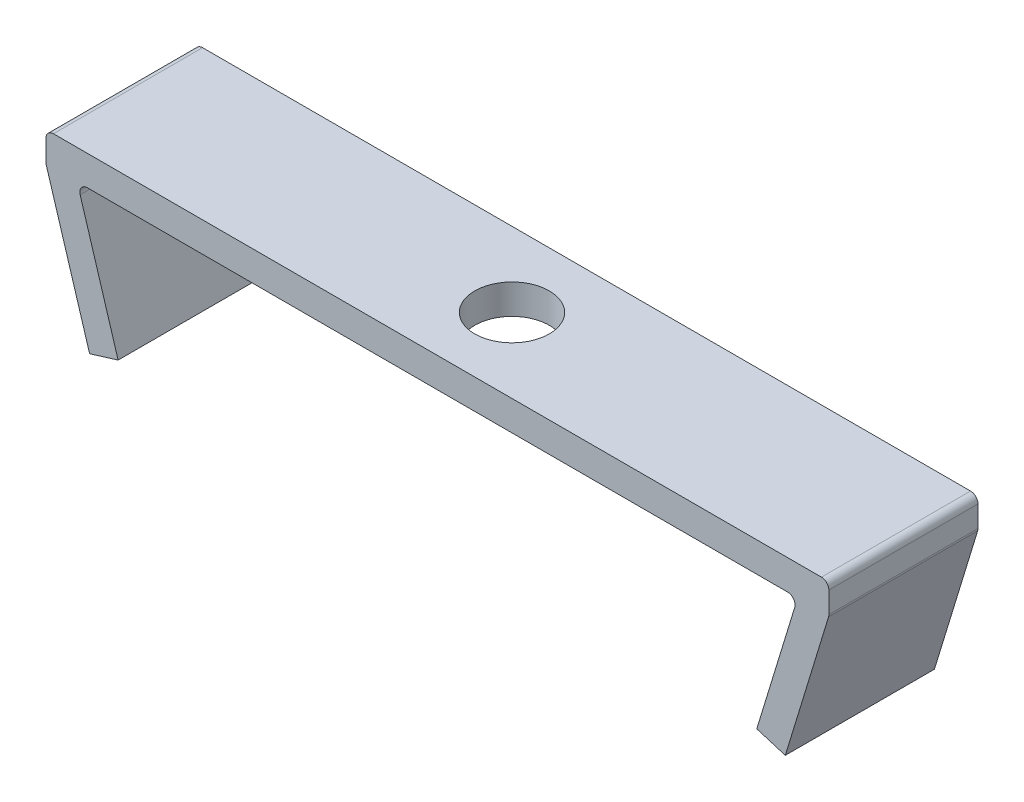
ISO-10303-21;
HEADER;
FILE_DESCRIPTION(('STEP AP214'),'2;1');
FILE_NAME('part.step','',(''),(''),'','','');
FILE_SCHEMA(('AUTOMOTIVE_DESIGN { 1 0 10303 214 1 1 1 1 }'));
ENDSEC;
DATA;
#1=APPLICATION_CONTEXT('core data for automotive mechanical design processes');
#2=APPLICATION_PROTOCOL_DEFINITION('international standard','automotive_design',2000,#1);
#3=PRODUCT_CONTEXT('',#1,'mechanical');
#4=PRODUCT('Part','Part','',(#3));
#5=PRODUCT_RELATED_PRODUCT_CATEGORY('part','',(#4));
#6=PRODUCT_DEFINITION_FORMATION('','',#4);
#7=PRODUCT_DEFINITION_CONTEXT('part definition',#1,'design');
#8=PRODUCT_DEFINITION('design','',#6,#7);
#9=PRODUCT_DEFINITION_SHAPE('','',#8);
#10=(LENGTH_UNIT() NAMED_UNIT(*) SI_UNIT(.MILLI.,.METRE.));
#11=(NAMED_UNIT(*) PLANE_ANGLE_UNIT() SI_UNIT($,.RADIAN.));
#12=(NAMED_UNIT(*) SI_UNIT($,.STERADIAN.) SOLID_ANGLE_UNIT());
#13=UNCERTAINTY_MEASURE_WITH_UNIT(LENGTH_MEASURE(1.E-05),#10,'distance_accuracy_value','');
#14=(GEOMETRIC_REPRESENTATION_CONTEXT(3) GLOBAL_UNCERTAINTY_ASSIGNED_CONTEXT((#13)) GLOBAL_UNIT_ASSIGNED_CONTEXT((#10,
#11,#12)) REPRESENTATION_CONTEXT('',''));
#15=CARTESIAN_POINT('',(0.,0.,0.));
#16=DIRECTION('',(0.,0.,1.));
#17=DIRECTION('',(1.,0.,0.));
#18=AXIS2_PLACEMENT_3D('',#15,#16,#17);
#19=CARTESIAN_POINT('',(66.675,2.54000000000001,12.7));
#20=DIRECTION('',(-1.,0.,0.));
#21=DIRECTION('',(0.,0.,1.));
#22=AXIS2_PLACEMENT_3D('',#19,#20,#21);
#23=PLANE('',#22);
#24=DIRECTION('',(0.,1.,0.));
#25=VECTOR('',#24,1.);
#26=CARTESIAN_POINT('',(66.675,2.54000000000001,12.7));
#27=LINE('',#26,#25);
#28=CARTESIAN_POINT('',(66.675,-2.35019722828658,12.7));
#29=VERTEX_POINT('',#28);
#30=CARTESIAN_POINT('',(66.675,1.26999999999999,12.7));
#31=VERTEX_POINT('',#30);
#32=EDGE_CURVE('E229',#29,#31,#27,.T.);
#33=ORIENTED_EDGE('',*,*,#32,.F.);
#34=DIRECTION('',(0.,0.,-1.));
#35=VECTOR('',#34,1.);
#36=CARTESIAN_POINT('',(66.675,-2.35019722828658,12.7));
#37=LINE('',#36,#35);
#38=CARTESIAN_POINT('',(66.675,-2.35019722828658,-12.7));
#39=VERTEX_POINT('',#38);
#40=EDGE_CURVE('E274',#29,#39,#37,.T.);
#41=ORIENTED_EDGE('',*,*,#40,.T.);
#42=DIRECTION('',(0.,1.,0.));
#43=VECTOR('',#42,1.);
#44=CARTESIAN_POINT('',(66.675,2.54000000000001,-12.7));
#45=LINE('',#44,#43);
#46=CARTESIAN_POINT('',(66.675,1.26999999999999,-12.7));
#47=VERTEX_POINT('',#46);
#48=EDGE_CURVE('E204',#39,#47,#45,.T.);
#49=ORIENTED_EDGE('',*,*,#48,.T.);
#50=DIRECTION('',(0.,0.,-1.));
#51=VECTOR('',#50,1.);
#52=CARTESIAN_POINT('',(66.675,1.26999999999999,12.7));
#53=LINE('',#52,#51);
#54=EDGE_CURVE('E272',#47,#31,#53,.F.);
#55=ORIENTED_EDGE('',*,*,#54,.T.);
#56=EDGE_LOOP('',(#33,#41,#49,#55));
#57=FACE_BOUND('',#56,.T.);
#58=ADVANCED_FACE('F50',(#57),#23,.F.);
#59=CARTESIAN_POINT('',(-66.675,2.54000000000001,12.7));
#60=DIRECTION('',(0.,-1.,0.));
#61=DIRECTION('',(1.,0.,0.));
#62=AXIS2_PLACEMENT_3D('',#59,#60,#61);
#63=PLANE('',#62);
#64=CARTESIAN_POINT('',(0.,2.54000000000001,0.));
#65=DIRECTION('',(0.,1.,0.));
#66=DIRECTION('',(0.,0.,1.));
#67=AXIS2_PLACEMENT_3D('',#64,#65,#66);
#68=CIRCLE('',#67,6.35);
#69=CARTESIAN_POINT('',(0.,2.54000000000001,6.35));
#70=VERTEX_POINT('',#69);
#71=EDGE_CURVE('E238',#70,#70,#68,.T.);
#72=ORIENTED_EDGE('',*,*,#71,.F.);
#73=EDGE_LOOP('',(#72));
#74=FACE_BOUND('',#73,.T.);
#75=DIRECTION('',(-1.,0.,0.));
#76=VECTOR('',#75,1.);
#77=CARTESIAN_POINT('',(-66.675,2.54000000000001,-12.7));
#78=LINE('',#77,#76);
#79=CARTESIAN_POINT('',(65.405,2.54000000000001,-12.7));
#80=VERTEX_POINT('',#79);
#81=CARTESIAN_POINT('',(-65.405,2.54000000000001,-12.7));
#82=VERTEX_POINT('',#81);
#83=EDGE_CURVE('E207',#80,#82,#78,.T.);
#84=ORIENTED_EDGE('',*,*,#83,.T.);
#85=DIRECTION('',(0.,0.,-1.));
#86=VECTOR('',#85,1.);
#87=CARTESIAN_POINT('',(-65.405,2.54000000000001,12.7));
#88=LINE('',#87,#86);
#89=CARTESIAN_POINT('',(-65.405,2.54000000000001,12.7));
#90=VERTEX_POINT('',#89);
#91=EDGE_CURVE('E270',#82,#90,#88,.F.);
#92=ORIENTED_EDGE('',*,*,#91,.T.);
#93=DIRECTION('',(-1.,0.,0.));
#94=VECTOR('',#93,1.);
#95=CARTESIAN_POINT('',(-66.675,2.54000000000001,12.7));
#96=LINE('',#95,#94);
#97=CARTESIAN_POINT('',(65.405,2.54000000000001,12.7));
#98=VERTEX_POINT('',#97);
#99=EDGE_CURVE('E356',#98,#90,#96,.T.);
#100=ORIENTED_EDGE('',*,*,#99,.F.);
#101=DIRECTION('',(0.,0.,-1.));
#102=VECTOR('',#101,1.);
#103=CARTESIAN_POINT('',(65.405,2.54000000000001,12.7));
#104=LINE('',#103,#102);
#105=EDGE_CURVE('E267',#98,#80,#104,.T.);
#106=ORIENTED_EDGE('',*,*,#105,.T.);
#107=EDGE_LOOP('',(#84,#92,#100,#106));
#108=FACE_BOUND('',#107,.T.);
#109=ADVANCED_FACE('F316',(#74,#108),#63,.F.);
#110=CARTESIAN_POINT('',(-66.675,2.54000000000001,12.7));
#111=DIRECTION('',(1.,0.,0.));
#112=DIRECTION('',(0.,0.,-1.));
#113=AXIS2_PLACEMENT_3D('',#110,#111,#112);
#114=PLANE('',#113);
#115=DIRECTION('',(0.,-1.,0.));
#116=VECTOR('',#115,1.);
#117=CARTESIAN_POINT('',(-66.675,2.54000000000001,-12.7));
#118=LINE('',#117,#116);
#119=CARTESIAN_POINT('',(-66.675,1.26999999999999,-12.7));
#120=VERTEX_POINT('',#119);
#121=CARTESIAN_POINT('',(-66.675,-2.35019722828658,-12.7));
#122=VERTEX_POINT('',#121);
#123=EDGE_CURVE('E211',#120,#122,#118,.T.);
#124=ORIENTED_EDGE('',*,*,#123,.T.);
#125=DIRECTION('',(0.,0.,-1.));
#126=VECTOR('',#125,1.);
#127=CARTESIAN_POINT('',(-66.675,-2.35019722828658,12.7));
#128=LINE('',#127,#126);
#129=CARTESIAN_POINT('',(-66.675,-2.35019722828658,12.7));
#130=VERTEX_POINT('',#129);
#131=EDGE_CURVE('E258',#122,#130,#128,.F.);
#132=ORIENTED_EDGE('',*,*,#131,.T.);
#133=DIRECTION('',(0.,-1.,0.));
#134=VECTOR('',#133,1.);
#135=CARTESIAN_POINT('',(-66.675,2.54000000000001,12.7));
#136=LINE('',#135,#134);
#137=CARTESIAN_POINT('',(-66.675,1.26999999999999,12.7));
#138=VERTEX_POINT('',#137);
#139=EDGE_CURVE('E175',#138,#130,#136,.T.);
#140=ORIENTED_EDGE('',*,*,#139,.F.);
#141=DIRECTION('',(0.,0.,-1.));
#142=VECTOR('',#141,1.);
#143=CARTESIAN_POINT('',(-66.675,1.26999999999999,12.7));
#144=LINE('',#143,#142);
#145=EDGE_CURVE('E255',#138,#120,#144,.T.);
#146=ORIENTED_EDGE('',*,*,#145,.T.);
#147=EDGE_LOOP('',(#124,#132,#140,#146));
#148=FACE_BOUND('',#147,.T.);
#149=ADVANCED_FACE('F322',(#148),#114,.F.);
#150=CARTESIAN_POINT('',(-66.675,-2.53999999999999,12.7));
#151=DIRECTION('',(0.956304755963036,0.292371704722734,0.));
#152=DIRECTION('',(-0.292371704722734,0.956304755963036,0.));
#153=AXIS2_PLACEMENT_3D('',#150,#151,#152);
#154=PLANE('',#153);
#155=DIRECTION('',(0.292371704722734,-0.956304755963036,0.));
#156=VECTOR('',#155,1.);
#157=CARTESIAN_POINT('',(-66.675,-2.53999999999999,12.7));
#158=LINE('',#157,#156);
#159=CARTESIAN_POINT('',(-66.6195070400731,-2.72150929328444,12.7));
#160=VERTEX_POINT('',#159);
#161=CARTESIAN_POINT('',(-59.2487587000426,-26.8301408014611,12.7));
#162=VERTEX_POINT('',#161);
#163=EDGE_CURVE('E162',#160,#162,#158,.T.);
#164=ORIENTED_EDGE('',*,*,#163,.F.);
#165=DIRECTION('',(0.,0.,-1.));
#166=VECTOR('',#165,1.);
#167=CARTESIAN_POINT('',(-66.6195070400731,-2.72150929328444,12.7));
#168=LINE('',#167,#166);
#169=CARTESIAN_POINT('',(-66.6195070400731,-2.72150929328444,-12.7));
#170=VERTEX_POINT('',#169);
#171=EDGE_CURVE('E245',#160,#170,#168,.T.);
#172=ORIENTED_EDGE('',*,*,#171,.T.);
#173=DIRECTION('',(0.292371704722734,-0.956304755963036,0.));
#174=VECTOR('',#173,1.);
#175=CARTESIAN_POINT('',(-66.675,-2.53999999999999,-12.7));
#176=LINE('',#175,#174);
#177=CARTESIAN_POINT('',(-59.2487587000426,-26.8301408014611,-12.7));
#178=VERTEX_POINT('',#177);
#179=EDGE_CURVE('E181',#170,#178,#176,.T.);
#180=ORIENTED_EDGE('',*,*,#179,.T.);
#181=DIRECTION('',(0.,0.,-1.));
#182=VECTOR('',#181,1.);
#183=CARTESIAN_POINT('',(-59.2487587000426,-26.8301408014611,12.7));
#184=LINE('',#183,#182);
#185=EDGE_CURVE('E178',#162,#178,#184,.T.);
#186=ORIENTED_EDGE('',*,*,#185,.F.);
#187=EDGE_LOOP('',(#164,#172,#180,#186));
#188=FACE_BOUND('',#187,.T.);
#189=ADVANCED_FACE('F179',(#188),#154,.F.);
#190=CARTESIAN_POINT('',(-59.2487587000426,-26.8301408014611,12.7));
#191=DIRECTION('',(-0.292371704722734,0.956304755963036,0.));
#192=DIRECTION('',(-0.956304755963036,-0.292371704722734,0.));
#193=AXIS2_PLACEMENT_3D('',#190,#191,#192);
#194=PLANE('',#193);
#195=DIRECTION('',(0.956304755963036,0.292371704722734,0.));
#196=VECTOR('',#195,1.);
#197=CARTESIAN_POINT('',(-59.2487587000426,-26.8301408014611,-12.7));
#198=LINE('',#197,#196);
#199=CARTESIAN_POINT('',(-54.3907305397503,-25.3448925414696,-12.7));
#200=VERTEX_POINT('',#199);
#201=EDGE_CURVE('E215',#178,#200,#198,.T.);
#202=ORIENTED_EDGE('',*,*,#201,.T.);
#203=DIRECTION('',(0.,0.,-1.));
#204=VECTOR('',#203,1.);
#205=CARTESIAN_POINT('',(-54.3907305397503,-25.3448925414696,12.7));
#206=LINE('',#205,#204);
#207=CARTESIAN_POINT('',(-54.3907305397503,-25.3448925414696,12.7));
#208=VERTEX_POINT('',#207);
#209=EDGE_CURVE('E185',#208,#200,#206,.T.);
#210=ORIENTED_EDGE('',*,*,#209,.F.);
#211=DIRECTION('',(0.956304755963036,0.292371704722734,0.));
#212=VECTOR('',#211,1.);
#213=CARTESIAN_POINT('',(-59.2487587000426,-26.8301408014611,12.7));
#214=LINE('',#213,#212);
#215=EDGE_CURVE('E168',#162,#208,#214,.T.);
#216=ORIENTED_EDGE('',*,*,#215,.F.);
#217=ORIENTED_EDGE('',*,*,#185,.T.);
#218=EDGE_LOOP('',(#202,#210,#216,#217));
#219=FACE_BOUND('',#218,.T.);
#220=ADVANCED_FACE('F187',(#219),#194,.F.);
#221=CARTESIAN_POINT('',(-54.3907305397503,-25.3448925414696,12.7));
#222=DIRECTION('',(-0.956304755963036,-0.292371704722734,0.));
#223=DIRECTION('',(0.292371704722734,-0.956304755963036,0.));
#224=AXIS2_PLACEMENT_3D('',#221,#222,#223);
#225=PLANE('',#224);
#226=DIRECTION('',(-0.292371704722734,0.956304755963036,0.));
#227=VECTOR('',#226,1.);
#228=CARTESIAN_POINT('',(-54.3907305397503,-25.3448925414696,-12.7));
#229=LINE('',#228,#227);
#230=CARTESIAN_POINT('',(-60.8610864209272,-4.18131206499786,-12.7));
#231=VERTEX_POINT('',#230);
#232=EDGE_CURVE('E217',#200,#231,#229,.T.);
#233=ORIENTED_EDGE('',*,*,#232,.T.);
#234=DIRECTION('',(0.,0.,-1.));
#235=VECTOR('',#234,1.);
#236=CARTESIAN_POINT('',(-60.8610864209272,-4.18131206499786,12.7));
#237=LINE('',#236,#235);
#238=CARTESIAN_POINT('',(-60.8610864209272,-4.18131206499786,12.7));
#239=VERTEX_POINT('',#238);
#240=EDGE_CURVE('E243',#231,#239,#237,.F.);
#241=ORIENTED_EDGE('',*,*,#240,.T.);
#242=DIRECTION('',(-0.292371704722734,0.956304755963036,0.));
#243=VECTOR('',#242,1.);
#244=CARTESIAN_POINT('',(-54.3907305397503,-25.3448925414696,12.7));
#245=LINE('',#244,#243);
#246=EDGE_CURVE('E190',#208,#239,#245,.T.);
#247=ORIENTED_EDGE('',*,*,#246,.F.);
#248=ORIENTED_EDGE('',*,*,#209,.T.);
#249=EDGE_LOOP('',(#233,#241,#247,#248));
#250=FACE_BOUND('',#249,.T.);
#251=ADVANCED_FACE('F373',(#250),#225,.F.);
#252=CARTESIAN_POINT('',(-61.3628858770453,-2.53999999999999,12.7));
#253=DIRECTION('',(0.,1.,0.));
#254=DIRECTION('',(0.,0.,1.));
#255=AXIS2_PLACEMENT_3D('',#252,#253,#254);
#256=PLANE('',#255);
#257=CARTESIAN_POINT('',(0.,-2.53999999999999,0.));
#258=DIRECTION('',(0.,1.,0.));
#259=DIRECTION('',(0.,0.,1.));
#260=AXIS2_PLACEMENT_3D('',#257,#258,#259);
#261=CIRCLE('',#260,6.35);
#262=CARTESIAN_POINT('',(0.,-2.53999999999999,6.35));
#263=VERTEX_POINT('',#262);
#264=EDGE_CURVE('E208',#263,#263,#261,.T.);
#265=ORIENTED_EDGE('',*,*,#264,.T.);
#266=EDGE_LOOP('',(#265));
#267=FACE_BOUND('',#266,.T.);
#268=DIRECTION('',(1.,0.,0.));
#269=VECTOR('',#268,1.);
#270=CARTESIAN_POINT('',(-61.3628858770453,-2.53999999999999,12.7));
#271=LINE('',#270,#269);
#272=CARTESIAN_POINT('',(-59.6465793808541,-2.53999999999999,12.7));
#273=VERTEX_POINT('',#272);
#274=CARTESIAN_POINT('',(59.6465793808541,-2.53999999999999,12.7));
#275=VERTEX_POINT('',#274);
#276=EDGE_CURVE('E192',#273,#275,#271,.T.);
#277=ORIENTED_EDGE('',*,*,#276,.F.);
#278=DIRECTION('',(0.,0.,-1.));
#279=VECTOR('',#278,1.);
#280=CARTESIAN_POINT('',(-59.6465793808541,-2.53999999999999,-12.7));
#281=LINE('',#280,#279);
#282=CARTESIAN_POINT('',(-59.6465793808541,-2.53999999999999,-12.7));
#283=VERTEX_POINT('',#282);
#284=EDGE_CURVE('E240',#273,#283,#281,.T.);
#285=ORIENTED_EDGE('',*,*,#284,.T.);
#286=DIRECTION('',(1.,0.,0.));
#287=VECTOR('',#286,1.);
#288=CARTESIAN_POINT('',(-61.3628858770453,-2.53999999999999,-12.7));
#289=LINE('',#288,#287);
#290=CARTESIAN_POINT('',(59.6465793808541,-2.53999999999999,-12.7));
#291=VERTEX_POINT('',#290);
#292=EDGE_CURVE('E220',#283,#291,#289,.T.);
#293=ORIENTED_EDGE('',*,*,#292,.T.);
#294=DIRECTION('',(0.,0.,-1.));
#295=VECTOR('',#294,1.);
#296=CARTESIAN_POINT('',(59.6465793808541,-2.53999999999999,12.7));
#297=LINE('',#296,#295);
#298=EDGE_CURVE('E184',#291,#275,#297,.F.);
#299=ORIENTED_EDGE('',*,*,#298,.T.);
#300=EDGE_LOOP('',(#277,#285,#293,#299));
#301=FACE_BOUND('',#300,.T.);
#302=ADVANCED_FACE('F294',(#267,#301),#256,.F.);
#303=CARTESIAN_POINT('',(54.3907305397503,-25.3448925414696,12.7));
#304=DIRECTION('',(0.956304755963036,-0.292371704722734,0.));
#305=DIRECTION('',(0.292371704722734,0.956304755963036,0.));
#306=AXIS2_PLACEMENT_3D('',#303,#304,#305);
#307=PLANE('',#306);
#308=DIRECTION('',(-0.292371704722734,-0.956304755963036,0.));
#309=VECTOR('',#308,1.);
#310=CARTESIAN_POINT('',(54.3907305397503,-25.3448925414696,12.7));
#311=LINE('',#310,#309);
#312=CARTESIAN_POINT('',(60.8610864209272,-4.18131206499786,12.7));
#313=VERTEX_POINT('',#312);
#314=CARTESIAN_POINT('',(54.3907305397503,-25.3448925414696,12.7));
#315=VERTEX_POINT('',#314);
#316=EDGE_CURVE('E197',#313,#315,#311,.T.);
#317=ORIENTED_EDGE('',*,*,#316,.F.);
#318=DIRECTION('',(0.,0.,-1.));
#319=VECTOR('',#318,1.);
#320=CARTESIAN_POINT('',(60.8610864209272,-4.18131206499786,-12.7));
#321=LINE('',#320,#319);
#322=CARTESIAN_POINT('',(60.8610864209272,-4.18131206499786,-12.7));
#323=VERTEX_POINT('',#322);
#324=EDGE_CURVE('E278',#313,#323,#321,.T.);
#325=ORIENTED_EDGE('',*,*,#324,.T.);
#326=DIRECTION('',(-0.292371704722734,-0.956304755963036,0.));
#327=VECTOR('',#326,1.);
#328=CARTESIAN_POINT('',(54.3907305397503,-25.3448925414696,-12.7));
#329=LINE('',#328,#327);
#330=CARTESIAN_POINT('',(54.3907305397503,-25.3448925414696,-12.7));
#331=VERTEX_POINT('',#330);
#332=EDGE_CURVE('E223',#323,#331,#329,.T.);
#333=ORIENTED_EDGE('',*,*,#332,.T.);
#334=DIRECTION('',(0.,0.,-1.));
#335=VECTOR('',#334,1.);
#336=CARTESIAN_POINT('',(54.3907305397503,-25.3448925414696,12.7));
#337=LINE('',#336,#335);
#338=EDGE_CURVE('E232',#315,#331,#337,.T.);
#339=ORIENTED_EDGE('',*,*,#338,.F.);
#340=EDGE_LOOP('',(#317,#325,#333,#339));
#341=FACE_BOUND('',#340,.T.);
#342=ADVANCED_FACE('F297',(#341),#307,.F.);
#343=CARTESIAN_POINT('',(59.2487587000426,-26.8301408014611,12.7));
#344=DIRECTION('',(0.292371704722734,0.956304755963036,0.));
#345=DIRECTION('',(-0.956304755963036,0.292371704722734,0.));
#346=AXIS2_PLACEMENT_3D('',#343,#344,#345);
#347=PLANE('',#346);
#348=DIRECTION('',(0.956304755963036,-0.292371704722734,0.));
#349=VECTOR('',#348,1.);
#350=CARTESIAN_POINT('',(59.2487587000426,-26.8301408014611,-12.7));
#351=LINE('',#350,#349);
#352=CARTESIAN_POINT('',(59.2487587000426,-26.8301408014611,-12.7));
#353=VERTEX_POINT('',#352);
#354=EDGE_CURVE('E225',#331,#353,#351,.T.);
#355=ORIENTED_EDGE('',*,*,#354,.T.);
#356=DIRECTION('',(0.,0.,-1.));
#357=VECTOR('',#356,1.);
#358=CARTESIAN_POINT('',(59.2487587000426,-26.8301408014611,12.7));
#359=LINE('',#358,#357);
#360=CARTESIAN_POINT('',(59.2487587000426,-26.8301408014611,12.7));
#361=VERTEX_POINT('',#360);
#362=EDGE_CURVE('E203',#361,#353,#359,.T.);
#363=ORIENTED_EDGE('',*,*,#362,.F.);
#364=DIRECTION('',(0.956304755963036,-0.292371704722734,0.));
#365=VECTOR('',#364,1.);
#366=CARTESIAN_POINT('',(59.2487587000426,-26.8301408014611,12.7));
#367=LINE('',#366,#365);
#368=EDGE_CURVE('E199',#315,#361,#367,.T.);
#369=ORIENTED_EDGE('',*,*,#368,.F.);
#370=ORIENTED_EDGE('',*,*,#338,.T.);
#371=EDGE_LOOP('',(#355,#363,#369,#370));
#372=FACE_BOUND('',#371,.T.);
#373=ADVANCED_FACE('F303',(#372),#347,.F.);
#374=CARTESIAN_POINT('',(66.675,-2.53999999999999,12.7));
#375=DIRECTION('',(-0.956304755963036,0.292371704722734,0.));
#376=DIRECTION('',(-0.292371704722734,-0.956304755963036,0.));
#377=AXIS2_PLACEMENT_3D('',#374,#375,#376);
#378=PLANE('',#377);
#379=DIRECTION('',(0.292371704722734,0.956304755963036,0.));
#380=VECTOR('',#379,1.);
#381=CARTESIAN_POINT('',(66.675,-2.53999999999999,-12.7));
#382=LINE('',#381,#380);
#383=CARTESIAN_POINT('',(66.6195070400731,-2.72150929328444,-12.7));
#384=VERTEX_POINT('',#383);
#385=EDGE_CURVE('E227',#353,#384,#382,.T.);
#386=ORIENTED_EDGE('',*,*,#385,.T.);
#387=DIRECTION('',(0.,0.,-1.));
#388=VECTOR('',#387,1.);
#389=CARTESIAN_POINT('',(66.6195070400731,-2.72150929328444,12.7));
#390=LINE('',#389,#388);
#391=CARTESIAN_POINT('',(66.6195070400731,-2.72150929328444,12.7));
#392=VERTEX_POINT('',#391);
#393=EDGE_CURVE('E65',#384,#392,#390,.F.);
#394=ORIENTED_EDGE('',*,*,#393,.T.);
#395=DIRECTION('',(0.292371704722734,0.956304755963036,0.));
#396=VECTOR('',#395,1.);
#397=CARTESIAN_POINT('',(66.675,-2.53999999999999,12.7));
#398=LINE('',#397,#396);
#399=EDGE_CURVE('E201',#361,#392,#398,.T.);
#400=ORIENTED_EDGE('',*,*,#399,.F.);
#401=ORIENTED_EDGE('',*,*,#362,.T.);
#402=EDGE_LOOP('',(#386,#394,#400,#401));
#403=FACE_BOUND('',#402,.T.);
#404=ADVANCED_FACE('F305',(#403),#378,.F.);
#405=CARTESIAN_POINT('',(0.,0.,12.7));
#406=DIRECTION('',(0.,0.,1.));
#407=DIRECTION('',(1.,0.,0.));
#408=AXIS2_PLACEMENT_3D('',#405,#406,#407);
#409=PLANE('',#408);
#410=ORIENTED_EDGE('',*,*,#139,.T.);
#411=CARTESIAN_POINT('',(-65.405,-2.35019722828658,12.7));
#412=DIRECTION('',(0.,0.,1.));
#413=DIRECTION('',(1.,0.,0.));
#414=AXIS2_PLACEMENT_3D('',#411,#412,#413);
#415=CIRCLE('',#414,1.27);
#416=EDGE_CURVE('E171',#130,#160,#415,.T.);
#417=ORIENTED_EDGE('',*,*,#416,.T.);
#418=ORIENTED_EDGE('',*,*,#163,.T.);
#419=ORIENTED_EDGE('',*,*,#215,.T.);
#420=ORIENTED_EDGE('',*,*,#246,.T.);
#421=CARTESIAN_POINT('',(-59.6465793808541,-3.80999999999998,12.7));
#422=DIRECTION('',(0.,0.,1.));
#423=DIRECTION('',(1.,0.,0.));
#424=AXIS2_PLACEMENT_3D('',#421,#422,#423);
#425=CIRCLE('',#424,1.27);
#426=EDGE_CURVE('E283',#239,#273,#425,.F.);
#427=ORIENTED_EDGE('',*,*,#426,.T.);
#428=ORIENTED_EDGE('',*,*,#276,.T.);
#429=CARTESIAN_POINT('',(59.6465793808541,-3.80999999999998,12.7));
#430=DIRECTION('',(0.,0.,1.));
#431=DIRECTION('',(1.,0.,0.));
#432=AXIS2_PLACEMENT_3D('',#429,#430,#431);
#433=CIRCLE('',#432,1.27);
#434=EDGE_CURVE('E13',#275,#313,#433,.F.);
#435=ORIENTED_EDGE('',*,*,#434,.T.);
#436=ORIENTED_EDGE('',*,*,#316,.T.);
#437=ORIENTED_EDGE('',*,*,#368,.T.);
#438=ORIENTED_EDGE('',*,*,#399,.T.);
#439=CARTESIAN_POINT('',(65.405,-2.35019722828658,12.7));
#440=DIRECTION('',(0.,0.,1.));
#441=DIRECTION('',(1.,0.,0.));
#442=AXIS2_PLACEMENT_3D('',#439,#440,#441);
#443=CIRCLE('',#442,1.27);
#444=EDGE_CURVE('E262',#392,#29,#443,.T.);
#445=ORIENTED_EDGE('',*,*,#444,.T.);
#446=ORIENTED_EDGE('',*,*,#32,.T.);
#447=CARTESIAN_POINT('',(65.405,1.26999999999999,12.7));
#448=DIRECTION('',(0.,0.,1.));
#449=DIRECTION('',(1.,0.,0.));
#450=AXIS2_PLACEMENT_3D('',#447,#448,#449);
#451=CIRCLE('',#450,1.27);
#452=EDGE_CURVE('E260',#31,#98,#451,.T.);
#453=ORIENTED_EDGE('',*,*,#452,.T.);
#454=ORIENTED_EDGE('',*,*,#99,.T.);
#455=CARTESIAN_POINT('',(-65.405,1.26999999999999,12.7));
#456=DIRECTION('',(0.,0.,1.));
#457=DIRECTION('',(1.,0.,0.));
#458=AXIS2_PLACEMENT_3D('',#455,#456,#457);
#459=CIRCLE('',#458,1.27);
#460=EDGE_CURVE('E264',#90,#138,#459,.T.);
#461=ORIENTED_EDGE('',*,*,#460,.T.);
#462=EDGE_LOOP('',(#410,#417,#418,#419,#420,#427,#428,#435,#436,#437,#438,#445,#446,#453,#454,#461));
#463=FACE_BOUND('',#462,.T.);
#464=ADVANCED_FACE('F165',(#463),#409,.T.);
#465=CARTESIAN_POINT('',(0.,0.,-12.7));
#466=DIRECTION('',(0.,0.,1.));
#467=DIRECTION('',(1.,0.,0.));
#468=AXIS2_PLACEMENT_3D('',#465,#466,#467);
#469=PLANE('',#468);
#470=ORIENTED_EDGE('',*,*,#179,.F.);
#471=CARTESIAN_POINT('',(-65.405,-2.35019722828658,-12.7));
#472=DIRECTION('',(0.,0.,1.));
#473=DIRECTION('',(1.,0.,0.));
#474=AXIS2_PLACEMENT_3D('',#471,#472,#473);
#475=CIRCLE('',#474,1.27);
#476=EDGE_CURVE('E253',#170,#122,#475,.F.);
#477=ORIENTED_EDGE('',*,*,#476,.T.);
#478=ORIENTED_EDGE('',*,*,#123,.F.);
#479=CARTESIAN_POINT('',(-65.405,1.26999999999999,-12.7));
#480=DIRECTION('',(0.,0.,1.));
#481=DIRECTION('',(1.,0.,0.));
#482=AXIS2_PLACEMENT_3D('',#479,#480,#481);
#483=CIRCLE('',#482,1.27);
#484=EDGE_CURVE('E251',#120,#82,#483,.F.);
#485=ORIENTED_EDGE('',*,*,#484,.T.);
#486=ORIENTED_EDGE('',*,*,#83,.F.);
#487=CARTESIAN_POINT('',(65.405,1.26999999999999,-12.7));
#488=DIRECTION('',(0.,0.,1.));
#489=DIRECTION('',(1.,0.,0.));
#490=AXIS2_PLACEMENT_3D('',#487,#488,#489);
#491=CIRCLE('',#490,1.27);
#492=EDGE_CURVE('E247',#80,#47,#491,.F.);
#493=ORIENTED_EDGE('',*,*,#492,.T.);
#494=ORIENTED_EDGE('',*,*,#48,.F.);
#495=CARTESIAN_POINT('',(65.405,-2.35019722828658,-12.7));
#496=DIRECTION('',(0.,0.,1.));
#497=DIRECTION('',(1.,0.,0.));
#498=AXIS2_PLACEMENT_3D('',#495,#496,#497);
#499=CIRCLE('',#498,1.27);
#500=EDGE_CURVE('E249',#39,#384,#499,.F.);
#501=ORIENTED_EDGE('',*,*,#500,.T.);
#502=ORIENTED_EDGE('',*,*,#385,.F.);
#503=ORIENTED_EDGE('',*,*,#354,.F.);
#504=ORIENTED_EDGE('',*,*,#332,.F.);
#505=CARTESIAN_POINT('',(59.6465793808541,-3.80999999999998,-12.7));
#506=DIRECTION('',(0.,0.,1.));
#507=DIRECTION('',(1.,0.,0.));
#508=AXIS2_PLACEMENT_3D('',#505,#506,#507);
#509=CIRCLE('',#508,1.27);
#510=EDGE_CURVE('E58',#323,#291,#509,.T.);
#511=ORIENTED_EDGE('',*,*,#510,.T.);
#512=ORIENTED_EDGE('',*,*,#292,.F.);
#513=CARTESIAN_POINT('',(-59.6465793808541,-3.80999999999998,-12.7));
#514=DIRECTION('',(0.,0.,1.));
#515=DIRECTION('',(1.,0.,0.));
#516=AXIS2_PLACEMENT_3D('',#513,#514,#515);
#517=CIRCLE('',#516,1.27);
#518=EDGE_CURVE('E281',#283,#231,#517,.T.);
#519=ORIENTED_EDGE('',*,*,#518,.T.);
#520=ORIENTED_EDGE('',*,*,#232,.F.);
#521=ORIENTED_EDGE('',*,*,#201,.F.);
#522=EDGE_LOOP('',(#470,#477,#478,#485,#486,#493,#494,#501,#502,#503,#504,#511,#512,#519,#520,#521));
#523=FACE_BOUND('',#522,.T.);
#524=ADVANCED_FACE('F287',(#523),#469,.F.);
#525=CARTESIAN_POINT('',(0.,-26.8301408014611,0.));
#526=DIRECTION('',(0.,1.,0.));
#527=DIRECTION('',(0.,0.,1.));
#528=AXIS2_PLACEMENT_3D('',#525,#526,#527);
#529=CYLINDRICAL_SURFACE('',#528,6.35);
#530=ORIENTED_EDGE('',*,*,#71,.T.);
#531=EDGE_LOOP('',(#530));
#532=FACE_BOUND('',#531,.T.);
#533=ORIENTED_EDGE('',*,*,#264,.F.);
#534=EDGE_LOOP('',(#533));
#535=FACE_BOUND('',#534,.T.);
#536=ADVANCED_FACE('F332',(#532,#535),#529,.F.);
#537=CARTESIAN_POINT('',(-59.6465793808541,-3.80999999999998,12.7));
#538=DIRECTION('',(0.,0.,1.));
#539=DIRECTION('',(1.,0.,0.));
#540=AXIS2_PLACEMENT_3D('',#537,#538,#539);
#541=CYLINDRICAL_SURFACE('',#540,1.27);
#542=ORIENTED_EDGE('',*,*,#426,.F.);
#543=ORIENTED_EDGE('',*,*,#240,.F.);
#544=ORIENTED_EDGE('',*,*,#518,.F.);
#545=ORIENTED_EDGE('',*,*,#284,.F.);
#546=EDGE_LOOP('',(#542,#543,#544,#545));
#547=FACE_BOUND('',#546,.T.);
#548=ADVANCED_FACE('F328',(#547),#541,.F.);
#549=CARTESIAN_POINT('',(-65.405,-2.35019722828658,12.7));
#550=DIRECTION('',(0.,0.,-1.));
#551=DIRECTION('',(-1.,0.,0.));
#552=AXIS2_PLACEMENT_3D('',#549,#550,#551);
#553=CYLINDRICAL_SURFACE('',#552,1.27);
#554=ORIENTED_EDGE('',*,*,#416,.F.);
#555=ORIENTED_EDGE('',*,*,#131,.F.);
#556=ORIENTED_EDGE('',*,*,#476,.F.);
#557=ORIENTED_EDGE('',*,*,#171,.F.);
#558=EDGE_LOOP('',(#554,#555,#556,#557));
#559=FACE_BOUND('',#558,.T.);
#560=ADVANCED_FACE('F331',(#559),#553,.T.);
#561=CARTESIAN_POINT('',(-65.405,1.26999999999999,12.7));
#562=DIRECTION('',(0.,0.,-1.));
#563=DIRECTION('',(-1.,0.,0.));
#564=AXIS2_PLACEMENT_3D('',#561,#562,#563);
#565=CYLINDRICAL_SURFACE('',#564,1.27);
#566=ORIENTED_EDGE('',*,*,#460,.F.);
#567=ORIENTED_EDGE('',*,*,#91,.F.);
#568=ORIENTED_EDGE('',*,*,#484,.F.);
#569=ORIENTED_EDGE('',*,*,#145,.F.);
#570=EDGE_LOOP('',(#566,#567,#568,#569));
#571=FACE_BOUND('',#570,.T.);
#572=ADVANCED_FACE('F336',(#571),#565,.T.);
#573=CARTESIAN_POINT('',(65.405,-2.35019722828658,12.7));
#574=DIRECTION('',(0.,0.,-1.));
#575=DIRECTION('',(-1.,0.,0.));
#576=AXIS2_PLACEMENT_3D('',#573,#574,#575);
#577=CYLINDRICAL_SURFACE('',#576,1.27);
#578=ORIENTED_EDGE('',*,*,#444,.F.);
#579=ORIENTED_EDGE('',*,*,#393,.F.);
#580=ORIENTED_EDGE('',*,*,#500,.F.);
#581=ORIENTED_EDGE('',*,*,#40,.F.);
#582=EDGE_LOOP('',(#578,#579,#580,#581));
#583=FACE_BOUND('',#582,.T.);
#584=ADVANCED_FACE('F340',(#583),#577,.T.);
#585=CARTESIAN_POINT('',(65.405,1.26999999999999,12.7));
#586=DIRECTION('',(0.,0.,-1.));
#587=DIRECTION('',(-1.,0.,0.));
#588=AXIS2_PLACEMENT_3D('',#585,#586,#587);
#589=CYLINDRICAL_SURFACE('',#588,1.27);
#590=ORIENTED_EDGE('',*,*,#452,.F.);
#591=ORIENTED_EDGE('',*,*,#54,.F.);
#592=ORIENTED_EDGE('',*,*,#492,.F.);
#593=ORIENTED_EDGE('',*,*,#105,.F.);
#594=EDGE_LOOP('',(#590,#591,#592,#593));
#595=FACE_BOUND('',#594,.T.);
#596=ADVANCED_FACE('F343',(#595),#589,.T.);
#597=CARTESIAN_POINT('',(59.6465793808541,-3.80999999999998,12.7));
#598=DIRECTION('',(0.,0.,1.));
#599=DIRECTION('',(1.,0.,0.));
#600=AXIS2_PLACEMENT_3D('',#597,#598,#599);
#601=CYLINDRICAL_SURFACE('',#600,1.27);
#602=ORIENTED_EDGE('',*,*,#434,.F.);
#603=ORIENTED_EDGE('',*,*,#298,.F.);
#604=ORIENTED_EDGE('',*,*,#510,.F.);
#605=ORIENTED_EDGE('',*,*,#324,.F.);
#606=EDGE_LOOP('',(#602,#603,#604,#605));
#607=FACE_BOUND('',#606,.T.);
#608=ADVANCED_FACE('F52',(#607),#601,.F.);
#609=CLOSED_SHELL('',(#58,#109,#149,#189,#220,#251,#302,#342,#373,#404,#464,#524,#536,#548,#560,
#572,#584,#596,#608));
#610=MANIFOLD_SOLID_BREP('B2',#609);
#611=ADVANCED_BREP_SHAPE_REPRESENTATION('',(#18,#610),#14);
#612=SHAPE_DEFINITION_REPRESENTATION(#9,#611);
ENDSEC;
END-ISO-10303-21;
